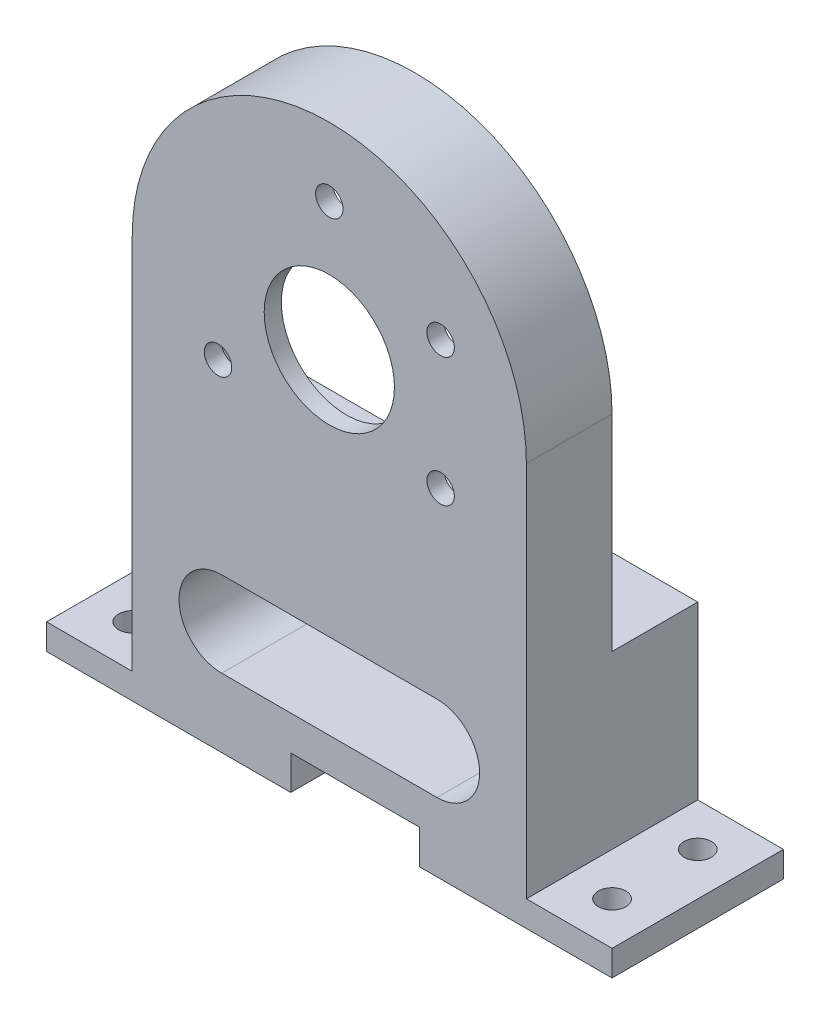
ISO-10303-21;
HEADER;
FILE_DESCRIPTION(('STEP AP214'),'2;1');
FILE_NAME('part.step','',(''),(''),'','','');
FILE_SCHEMA(('AUTOMOTIVE_DESIGN { 1 0 10303 214 1 1 1 1 }'));
ENDSEC;
DATA;
#1=APPLICATION_CONTEXT('core data for automotive mechanical design processes');
#2=APPLICATION_PROTOCOL_DEFINITION('international standard','automotive_design',2000,#1);
#3=PRODUCT_CONTEXT('',#1,'mechanical');
#4=PRODUCT('Part','Part','',(#3));
#5=PRODUCT_RELATED_PRODUCT_CATEGORY('part','',(#4));
#6=PRODUCT_DEFINITION_FORMATION('','',#4);
#7=PRODUCT_DEFINITION_CONTEXT('part definition',#1,'design');
#8=PRODUCT_DEFINITION('design','',#6,#7);
#9=PRODUCT_DEFINITION_SHAPE('','',#8);
#10=(LENGTH_UNIT() NAMED_UNIT(*) SI_UNIT(.MILLI.,.METRE.));
#11=(NAMED_UNIT(*) PLANE_ANGLE_UNIT() SI_UNIT($,.RADIAN.));
#12=(NAMED_UNIT(*) SI_UNIT($,.STERADIAN.) SOLID_ANGLE_UNIT());
#13=UNCERTAINTY_MEASURE_WITH_UNIT(LENGTH_MEASURE(1.E-05),#10,'distance_accuracy_value','');
#14=(GEOMETRIC_REPRESENTATION_CONTEXT(3) GLOBAL_UNCERTAINTY_ASSIGNED_CONTEXT((#13)) GLOBAL_UNIT_ASSIGNED_CONTEXT((#10,
#11,#12)) REPRESENTATION_CONTEXT('',''));
#15=CARTESIAN_POINT('',(0.,0.,0.));
#16=DIRECTION('',(0.,0.,1.));
#17=DIRECTION('',(1.,0.,0.));
#18=AXIS2_PLACEMENT_3D('',#15,#16,#17);
#19=CARTESIAN_POINT('',(0.,-47.,0.));
#20=DIRECTION('',(0.,-1.,0.));
#21=DIRECTION('',(0.,0.,-1.));
#22=AXIS2_PLACEMENT_3D('',#19,#20,#21);
#23=PLANE('',#22);
#24=DIRECTION('',(0.,0.,1.));
#25=VECTOR('',#24,1.);
#26=CARTESIAN_POINT('',(10.5,-47.,0.));
#27=LINE('',#26,#25);
#28=CARTESIAN_POINT('',(10.5,-47.,0.));
#29=VERTEX_POINT('',#28);
#30=CARTESIAN_POINT('',(10.5,-47.,20.));
#31=VERTEX_POINT('',#30);
#32=EDGE_CURVE('E197',#29,#31,#27,.T.);
#33=ORIENTED_EDGE('',*,*,#32,.F.);
#34=DIRECTION('',(1.,0.,0.));
#35=VECTOR('',#34,1.);
#36=CARTESIAN_POINT('',(-23.,-47.,0.));
#37=LINE('',#36,#35);
#38=CARTESIAN_POINT('',(33.,-47.,0.));
#39=VERTEX_POINT('',#38);
#40=EDGE_CURVE('E289',#29,#39,#37,.T.);
#41=ORIENTED_EDGE('',*,*,#40,.T.);
#42=DIRECTION('',(0.,0.,1.));
#43=VECTOR('',#42,1.);
#44=CARTESIAN_POINT('',(33.,-47.,20.));
#45=LINE('',#44,#43);
#46=CARTESIAN_POINT('',(33.,-47.,20.));
#47=VERTEX_POINT('',#46);
#48=EDGE_CURVE('E236',#39,#47,#45,.T.);
#49=ORIENTED_EDGE('',*,*,#48,.T.);
#50=DIRECTION('',(-1.,0.,0.));
#51=VECTOR('',#50,1.);
#52=CARTESIAN_POINT('',(23.,-47.,20.));
#53=LINE('',#52,#51);
#54=EDGE_CURVE('E296',#47,#31,#53,.T.);
#55=ORIENTED_EDGE('',*,*,#54,.T.);
#56=EDGE_LOOP('',(#33,#41,#49,#55));
#57=FACE_BOUND('',#56,.T.);
#58=CARTESIAN_POINT('',(28.,-47.,5.));
#59=DIRECTION('',(0.,-1.,0.));
#60=DIRECTION('',(0.,0.,-1.));
#61=AXIS2_PLACEMENT_3D('',#58,#59,#60);
#62=CIRCLE('',#61,1.6);
#63=CARTESIAN_POINT('',(28.,-47.,3.4));
#64=VERTEX_POINT('',#63);
#65=EDGE_CURVE('E230',#64,#64,#62,.T.);
#66=ORIENTED_EDGE('',*,*,#65,.F.);
#67=EDGE_LOOP('',(#66));
#68=FACE_BOUND('',#67,.T.);
#69=CARTESIAN_POINT('',(28.,-47.,15.));
#70=DIRECTION('',(0.,-1.,0.));
#71=DIRECTION('',(0.,0.,-1.));
#72=AXIS2_PLACEMENT_3D('',#69,#70,#71);
#73=CIRCLE('',#72,1.6);
#74=CARTESIAN_POINT('',(28.,-47.,13.4));
#75=VERTEX_POINT('',#74);
#76=EDGE_CURVE('E219',#75,#75,#73,.T.);
#77=ORIENTED_EDGE('',*,*,#76,.F.);
#78=EDGE_LOOP('',(#77));
#79=FACE_BOUND('',#78,.T.);
#80=ADVANCED_FACE('F37',(#57,#68,#79),#23,.T.);
#81=CARTESIAN_POINT('',(-23.,0.,20.));
#82=DIRECTION('',(1.,0.,0.));
#83=DIRECTION('',(0.,1.,0.));
#84=AXIS2_PLACEMENT_3D('',#81,#82,#83);
#85=PLANE('',#84);
#86=DIRECTION('',(0.,0.,1.));
#87=VECTOR('',#86,1.);
#88=CARTESIAN_POINT('',(-23.,-44.,20.));
#89=LINE('',#88,#87);
#90=CARTESIAN_POINT('',(-23.,-44.,0.));
#91=VERTEX_POINT('',#90);
#92=CARTESIAN_POINT('',(-23.,-44.,20.));
#93=VERTEX_POINT('',#92);
#94=EDGE_CURVE('E271',#91,#93,#89,.T.);
#95=ORIENTED_EDGE('',*,*,#94,.T.);
#96=DIRECTION('',(0.,-1.,0.));
#97=VECTOR('',#96,1.);
#98=CARTESIAN_POINT('',(-23.,0.,20.));
#99=LINE('',#98,#97);
#100=CARTESIAN_POINT('',(-23.,0.,20.));
#101=VERTEX_POINT('',#100);
#102=EDGE_CURVE('E346',#101,#93,#99,.T.);
#103=ORIENTED_EDGE('',*,*,#102,.F.);
#104=DIRECTION('',(0.,0.,-1.));
#105=VECTOR('',#104,1.);
#106=CARTESIAN_POINT('',(-23.,0.,20.));
#107=LINE('',#106,#105);
#108=CARTESIAN_POINT('',(-23.,0.,10.));
#109=VERTEX_POINT('',#108);
#110=EDGE_CURVE('E11',#101,#109,#107,.T.);
#111=ORIENTED_EDGE('',*,*,#110,.T.);
#112=DIRECTION('',(0.,1.,0.));
#113=VECTOR('',#112,1.);
#114=CARTESIAN_POINT('',(-23.,-24.,10.));
#115=LINE('',#114,#113);
#116=CARTESIAN_POINT('',(-23.,-24.,10.));
#117=VERTEX_POINT('',#116);
#118=EDGE_CURVE('E331',#117,#109,#115,.T.);
#119=ORIENTED_EDGE('',*,*,#118,.F.);
#120=DIRECTION('',(0.,0.,-1.));
#121=VECTOR('',#120,1.);
#122=CARTESIAN_POINT('',(-23.,-24.,10.));
#123=LINE('',#122,#121);
#124=CARTESIAN_POINT('',(-23.,-24.,0.));
#125=VERTEX_POINT('',#124);
#126=EDGE_CURVE('E337',#117,#125,#123,.T.);
#127=ORIENTED_EDGE('',*,*,#126,.T.);
#128=DIRECTION('',(0.,-1.,0.));
#129=VECTOR('',#128,1.);
#130=CARTESIAN_POINT('',(-23.,0.,0.));
#131=LINE('',#130,#129);
#132=EDGE_CURVE('E340',#125,#91,#131,.T.);
#133=ORIENTED_EDGE('',*,*,#132,.T.);
#134=EDGE_LOOP('',(#95,#103,#111,#119,#127,#133));
#135=FACE_BOUND('',#134,.T.);
#136=ADVANCED_FACE('F412',(#135),#85,.F.);
#137=CARTESIAN_POINT('',(0.,0.,20.));
#138=DIRECTION('',(0.,0.,-1.));
#139=DIRECTION('',(-1.,0.,0.));
#140=AXIS2_PLACEMENT_3D('',#137,#138,#139);
#141=CYLINDRICAL_SURFACE('',#140,23.);
#142=CARTESIAN_POINT('',(0.,0.,10.));
#143=DIRECTION('',(0.,0.,-1.));
#144=DIRECTION('',(-1.,0.,0.));
#145=AXIS2_PLACEMENT_3D('',#142,#143,#144);
#146=CIRCLE('',#145,23.);
#147=CARTESIAN_POINT('',(23.,0.,10.));
#148=VERTEX_POINT('',#147);
#149=EDGE_CURVE('E333',#109,#148,#146,.T.);
#150=ORIENTED_EDGE('',*,*,#149,.F.);
#151=ORIENTED_EDGE('',*,*,#110,.F.);
#152=CARTESIAN_POINT('',(0.,0.,20.));
#153=DIRECTION('',(0.,0.,1.));
#154=DIRECTION('',(1.,0.,0.));
#155=AXIS2_PLACEMENT_3D('',#152,#153,#154);
#156=CIRCLE('',#155,23.);
#157=CARTESIAN_POINT('',(23.,0.,20.));
#158=VERTEX_POINT('',#157);
#159=EDGE_CURVE('E343',#158,#101,#156,.T.);
#160=ORIENTED_EDGE('',*,*,#159,.F.);
#161=DIRECTION('',(0.,0.,-1.));
#162=VECTOR('',#161,1.);
#163=CARTESIAN_POINT('',(23.,0.,20.));
#164=LINE('',#163,#162);
#165=EDGE_CURVE('E46',#158,#148,#164,.T.);
#166=ORIENTED_EDGE('',*,*,#165,.T.);
#167=EDGE_LOOP('',(#150,#151,#160,#166));
#168=FACE_BOUND('',#167,.T.);
#169=ADVANCED_FACE('F39',(#168),#141,.T.);
#170=CARTESIAN_POINT('',(23.,-27.,20.));
#171=DIRECTION('',(-1.,0.,0.));
#172=DIRECTION('',(0.,-1.,0.));
#173=AXIS2_PLACEMENT_3D('',#170,#171,#172);
#174=PLANE('',#173);
#175=DIRECTION('',(0.,1.,0.));
#176=VECTOR('',#175,1.);
#177=CARTESIAN_POINT('',(23.,-27.,20.));
#178=LINE('',#177,#176);
#179=CARTESIAN_POINT('',(23.,-44.,20.));
#180=VERTEX_POINT('',#179);
#181=EDGE_CURVE('E350',#180,#158,#178,.T.);
#182=ORIENTED_EDGE('',*,*,#181,.F.);
#183=DIRECTION('',(0.,0.,-1.));
#184=VECTOR('',#183,1.);
#185=CARTESIAN_POINT('',(23.,-44.,20.));
#186=LINE('',#185,#184);
#187=CARTESIAN_POINT('',(23.,-44.,0.));
#188=VERTEX_POINT('',#187);
#189=EDGE_CURVE('E247',#180,#188,#186,.T.);
#190=ORIENTED_EDGE('',*,*,#189,.T.);
#191=DIRECTION('',(0.,1.,0.));
#192=VECTOR('',#191,1.);
#193=CARTESIAN_POINT('',(23.,-27.,0.));
#194=LINE('',#193,#192);
#195=CARTESIAN_POINT('',(23.,-24.,0.));
#196=VERTEX_POINT('',#195);
#197=EDGE_CURVE('E347',#188,#196,#194,.T.);
#198=ORIENTED_EDGE('',*,*,#197,.T.);
#199=DIRECTION('',(0.,0.,-1.));
#200=VECTOR('',#199,1.);
#201=CARTESIAN_POINT('',(23.,-24.,10.));
#202=LINE('',#201,#200);
#203=CARTESIAN_POINT('',(23.,-24.,10.));
#204=VERTEX_POINT('',#203);
#205=EDGE_CURVE('E335',#204,#196,#202,.T.);
#206=ORIENTED_EDGE('',*,*,#205,.F.);
#207=DIRECTION('',(0.,-1.,0.));
#208=VECTOR('',#207,1.);
#209=CARTESIAN_POINT('',(23.,0.,10.));
#210=LINE('',#209,#208);
#211=EDGE_CURVE('E325',#148,#204,#210,.T.);
#212=ORIENTED_EDGE('',*,*,#211,.F.);
#213=ORIENTED_EDGE('',*,*,#165,.F.);
#214=EDGE_LOOP('',(#182,#190,#198,#206,#212,#213));
#215=FACE_BOUND('',#214,.T.);
#216=ADVANCED_FACE('F402',(#215),#174,.F.);
#217=CARTESIAN_POINT('',(0.,0.,20.));
#218=DIRECTION('',(0.,0.,1.));
#219=DIRECTION('',(1.,0.,0.));
#220=AXIS2_PLACEMENT_3D('',#217,#218,#219);
#221=PLANE('',#220);
#222=CARTESIAN_POINT('',(12.5661510663552,-34.,20.));
#223=DIRECTION('',(0.,0.,-1.));
#224=DIRECTION('',(-1.,0.,0.));
#225=AXIS2_PLACEMENT_3D('',#222,#223,#224);
#226=CIRCLE('',#225,4.97169490372194);
#227=CARTESIAN_POINT('',(12.5661510663552,-29.0283050962781,20.));
#228=VERTEX_POINT('',#227);
#229=CARTESIAN_POINT('',(12.5661510663552,-38.9716949037219,20.));
#230=VERTEX_POINT('',#229);
#231=EDGE_CURVE('E166',#228,#230,#226,.T.);
#232=ORIENTED_EDGE('',*,*,#231,.T.);
#233=DIRECTION('',(-1.,0.,0.));
#234=VECTOR('',#233,1.);
#235=CARTESIAN_POINT('',(12.5661510663552,-38.9716949037219,20.));
#236=LINE('',#235,#234);
#237=CARTESIAN_POINT('',(-12.5661510663552,-38.9716949037219,20.));
#238=VERTEX_POINT('',#237);
#239=EDGE_CURVE('E175',#230,#238,#236,.T.);
#240=ORIENTED_EDGE('',*,*,#239,.T.);
#241=CARTESIAN_POINT('',(-12.5661510663552,-34.,20.));
#242=DIRECTION('',(0.,0.,-1.));
#243=DIRECTION('',(-1.,0.,0.));
#244=AXIS2_PLACEMENT_3D('',#241,#242,#243);
#245=CIRCLE('',#244,4.97169490372194);
#246=CARTESIAN_POINT('',(-12.5661510663552,-29.0283050962781,20.));
#247=VERTEX_POINT('',#246);
#248=EDGE_CURVE('E54',#238,#247,#245,.T.);
#249=ORIENTED_EDGE('',*,*,#248,.T.);
#250=DIRECTION('',(1.,0.,0.));
#251=VECTOR('',#250,1.);
#252=CARTESIAN_POINT('',(12.5661510663552,-29.0283050962781,20.));
#253=LINE('',#252,#251);
#254=EDGE_CURVE('E172',#247,#228,#253,.T.);
#255=ORIENTED_EDGE('',*,*,#254,.T.);
#256=EDGE_LOOP('',(#232,#240,#249,#255));
#257=FACE_BOUND('',#256,.T.);
#258=DIRECTION('',(0.,-1.,0.));
#259=VECTOR('',#258,1.);
#260=CARTESIAN_POINT('',(10.5,-43.,20.));
#261=LINE('',#260,#259);
#262=CARTESIAN_POINT('',(10.5,-43.,20.));
#263=VERTEX_POINT('',#262);
#264=EDGE_CURVE('E214',#263,#31,#261,.T.);
#265=ORIENTED_EDGE('',*,*,#264,.T.);
#266=ORIENTED_EDGE('',*,*,#54,.F.);
#267=DIRECTION('',(0.,-1.,0.));
#268=VECTOR('',#267,1.);
#269=CARTESIAN_POINT('',(33.,-44.,20.));
#270=LINE('',#269,#268);
#271=CARTESIAN_POINT('',(33.,-44.,20.));
#272=VERTEX_POINT('',#271);
#273=EDGE_CURVE('E253',#272,#47,#270,.T.);
#274=ORIENTED_EDGE('',*,*,#273,.F.);
#275=DIRECTION('',(-1.,0.,0.));
#276=VECTOR('',#275,1.);
#277=CARTESIAN_POINT('',(23.,-44.,20.));
#278=LINE('',#277,#276);
#279=EDGE_CURVE('E245',#272,#180,#278,.T.);
#280=ORIENTED_EDGE('',*,*,#279,.T.);
#281=ORIENTED_EDGE('',*,*,#181,.T.);
#282=ORIENTED_EDGE('',*,*,#159,.T.);
#283=ORIENTED_EDGE('',*,*,#102,.T.);
#284=DIRECTION('',(-1.,0.,0.));
#285=VECTOR('',#284,1.);
#286=CARTESIAN_POINT('',(-33.,-44.,20.));
#287=LINE('',#286,#285);
#288=CARTESIAN_POINT('',(-33.,-44.,20.));
#289=VERTEX_POINT('',#288);
#290=EDGE_CURVE('E274',#93,#289,#287,.T.);
#291=ORIENTED_EDGE('',*,*,#290,.T.);
#292=DIRECTION('',(0.,-1.,0.));
#293=VECTOR('',#292,1.);
#294=CARTESIAN_POINT('',(-33.,-44.,20.));
#295=LINE('',#294,#293);
#296=CARTESIAN_POINT('',(-33.,-47.,20.));
#297=VERTEX_POINT('',#296);
#298=EDGE_CURVE('E283',#289,#297,#295,.T.);
#299=ORIENTED_EDGE('',*,*,#298,.T.);
#300=CARTESIAN_POINT('',(-4.5,-47.,20.));
#301=VERTEX_POINT('',#300);
#302=EDGE_CURVE('E295',#301,#297,#53,.T.);
#303=ORIENTED_EDGE('',*,*,#302,.F.);
#304=DIRECTION('',(0.,-1.,0.));
#305=VECTOR('',#304,1.);
#306=CARTESIAN_POINT('',(-4.5,-43.,20.));
#307=LINE('',#306,#305);
#308=CARTESIAN_POINT('',(-4.5,-43.,20.));
#309=VERTEX_POINT('',#308);
#310=EDGE_CURVE('E223',#309,#301,#307,.T.);
#311=ORIENTED_EDGE('',*,*,#310,.F.);
#312=DIRECTION('',(-1.,0.,0.));
#313=VECTOR('',#312,1.);
#314=CARTESIAN_POINT('',(-4.5,-43.,20.));
#315=LINE('',#314,#313);
#316=EDGE_CURVE('E204',#263,#309,#315,.T.);
#317=ORIENTED_EDGE('',*,*,#316,.F.);
#318=EDGE_LOOP('',(#265,#266,#274,#280,#281,#282,#283,#291,#299,#303,#311,#317));
#319=FACE_BOUND('',#318,.T.);
#320=CARTESIAN_POINT('',(0.,0.,20.));
#321=DIRECTION('',(0.,0.,1.));
#322=DIRECTION('',(1.,0.,0.));
#323=AXIS2_PLACEMENT_3D('',#320,#321,#322);
#324=CIRCLE('',#323,7.6);
#325=CARTESIAN_POINT('',(7.6,0.,20.));
#326=VERTEX_POINT('',#325);
#327=EDGE_CURVE('E302',#326,#326,#324,.T.);
#328=ORIENTED_EDGE('',*,*,#327,.F.);
#329=EDGE_LOOP('',(#328));
#330=FACE_BOUND('',#329,.T.);
#331=CARTESIAN_POINT('',(0.,15.,20.));
#332=DIRECTION('',(0.,0.,1.));
#333=DIRECTION('',(1.,0.,0.));
#334=AXIS2_PLACEMENT_3D('',#331,#332,#333);
#335=CIRCLE('',#334,1.6);
#336=CARTESIAN_POINT('',(1.6,15.,20.));
#337=VERTEX_POINT('',#336);
#338=EDGE_CURVE('E306',#337,#337,#335,.T.);
#339=ORIENTED_EDGE('',*,*,#338,.F.);
#340=EDGE_LOOP('',(#339));
#341=FACE_BOUND('',#340,.T.);
#342=CARTESIAN_POINT('',(12.9903810567666,-7.5,20.));
#343=DIRECTION('',(0.,0.,1.));
#344=DIRECTION('',(1.,0.,0.));
#345=AXIS2_PLACEMENT_3D('',#342,#343,#344);
#346=CIRCLE('',#345,1.6);
#347=CARTESIAN_POINT('',(14.5903810567666,-7.5,20.));
#348=VERTEX_POINT('',#347);
#349=EDGE_CURVE('E305',#348,#348,#346,.T.);
#350=ORIENTED_EDGE('',*,*,#349,.F.);
#351=EDGE_LOOP('',(#350));
#352=FACE_BOUND('',#351,.T.);
#353=CARTESIAN_POINT('',(12.9903810567666,7.5,20.));
#354=DIRECTION('',(0.,0.,1.));
#355=DIRECTION('',(1.,0.,0.));
#356=AXIS2_PLACEMENT_3D('',#353,#354,#355);
#357=CIRCLE('',#356,1.6);
#358=CARTESIAN_POINT('',(14.5903810567666,7.5,20.));
#359=VERTEX_POINT('',#358);
#360=EDGE_CURVE('E313',#359,#359,#357,.T.);
#361=ORIENTED_EDGE('',*,*,#360,.F.);
#362=EDGE_LOOP('',(#361));
#363=FACE_BOUND('',#362,.T.);
#364=CARTESIAN_POINT('',(-12.9903810567666,-7.49999999999991,20.));
#365=DIRECTION('',(0.,0.,1.));
#366=DIRECTION('',(1.,0.,0.));
#367=AXIS2_PLACEMENT_3D('',#364,#365,#366);
#368=CIRCLE('',#367,1.6);
#369=CARTESIAN_POINT('',(-11.3903810567666,-7.49999999999991,20.));
#370=VERTEX_POINT('',#369);
#371=EDGE_CURVE('E310',#370,#370,#368,.T.);
#372=ORIENTED_EDGE('',*,*,#371,.F.);
#373=EDGE_LOOP('',(#372));
#374=FACE_BOUND('',#373,.T.);
#375=ADVANCED_FACE('F179',(#257,#319,#330,#341,#352,#363,#374),#221,.T.);
#376=CARTESIAN_POINT('',(0.,0.,0.));
#377=DIRECTION('',(0.,0.,1.));
#378=DIRECTION('',(1.,0.,0.));
#379=AXIS2_PLACEMENT_3D('',#376,#377,#378);
#380=PLANE('',#379);
#381=DIRECTION('',(-1.,0.,0.));
#382=VECTOR('',#381,1.);
#383=CARTESIAN_POINT('',(12.5661510663552,-38.9716949037219,0.));
#384=LINE('',#383,#382);
#385=CARTESIAN_POINT('',(12.5661510663552,-38.971694903722,0.));
#386=VERTEX_POINT('',#385);
#387=CARTESIAN_POINT('',(-12.5661510663552,-38.9716949037219,0.));
#388=VERTEX_POINT('',#387);
#389=EDGE_CURVE('E191',#386,#388,#384,.T.);
#390=ORIENTED_EDGE('',*,*,#389,.F.);
#391=CARTESIAN_POINT('',(12.5661510663552,-34.,0.));
#392=DIRECTION('',(0.,0.,-1.));
#393=DIRECTION('',(-1.,0.,0.));
#394=AXIS2_PLACEMENT_3D('',#391,#392,#393);
#395=CIRCLE('',#394,4.97169490372194);
#396=CARTESIAN_POINT('',(12.5661510663552,-29.0283050962781,0.));
#397=VERTEX_POINT('',#396);
#398=EDGE_CURVE('E62',#397,#386,#395,.T.);
#399=ORIENTED_EDGE('',*,*,#398,.F.);
#400=DIRECTION('',(1.,0.,0.));
#401=VECTOR('',#400,1.);
#402=CARTESIAN_POINT('',(12.5661510663552,-29.0283050962781,0.));
#403=LINE('',#402,#401);
#404=CARTESIAN_POINT('',(-12.5661510663552,-29.0283050962781,0.));
#405=VERTEX_POINT('',#404);
#406=EDGE_CURVE('E182',#405,#397,#403,.T.);
#407=ORIENTED_EDGE('',*,*,#406,.F.);
#408=CARTESIAN_POINT('',(-12.5661510663552,-34.,0.));
#409=DIRECTION('',(0.,0.,-1.));
#410=DIRECTION('',(-1.,0.,0.));
#411=AXIS2_PLACEMENT_3D('',#408,#409,#410);
#412=CIRCLE('',#411,4.97169490372194);
#413=EDGE_CURVE('E185',#388,#405,#412,.T.);
#414=ORIENTED_EDGE('',*,*,#413,.F.);
#415=EDGE_LOOP('',(#390,#399,#407,#414));
#416=FACE_BOUND('',#415,.T.);
#417=ORIENTED_EDGE('',*,*,#40,.F.);
#418=DIRECTION('',(0.,-1.,0.));
#419=VECTOR('',#418,1.);
#420=CARTESIAN_POINT('',(10.5,-43.,0.));
#421=LINE('',#420,#419);
#422=CARTESIAN_POINT('',(10.5,-43.,0.));
#423=VERTEX_POINT('',#422);
#424=EDGE_CURVE('E217',#423,#29,#421,.T.);
#425=ORIENTED_EDGE('',*,*,#424,.F.);
#426=DIRECTION('',(1.,0.,0.));
#427=VECTOR('',#426,1.);
#428=CARTESIAN_POINT('',(-4.5,-43.,0.));
#429=LINE('',#428,#427);
#430=CARTESIAN_POINT('',(-4.5,-43.,0.));
#431=VERTEX_POINT('',#430);
#432=EDGE_CURVE('E211',#431,#423,#429,.T.);
#433=ORIENTED_EDGE('',*,*,#432,.F.);
#434=DIRECTION('',(0.,-1.,0.));
#435=VECTOR('',#434,1.);
#436=CARTESIAN_POINT('',(-4.5,-43.,0.));
#437=LINE('',#436,#435);
#438=CARTESIAN_POINT('',(-4.5,-47.,0.));
#439=VERTEX_POINT('',#438);
#440=EDGE_CURVE('E220',#431,#439,#437,.T.);
#441=ORIENTED_EDGE('',*,*,#440,.T.);
#442=CARTESIAN_POINT('',(-33.,-47.,0.));
#443=VERTEX_POINT('',#442);
#444=EDGE_CURVE('E292',#443,#439,#37,.T.);
#445=ORIENTED_EDGE('',*,*,#444,.F.);
#446=DIRECTION('',(0.,-1.,0.));
#447=VECTOR('',#446,1.);
#448=CARTESIAN_POINT('',(-33.,-44.,0.));
#449=LINE('',#448,#447);
#450=CARTESIAN_POINT('',(-33.,-44.,0.));
#451=VERTEX_POINT('',#450);
#452=EDGE_CURVE('E286',#451,#443,#449,.T.);
#453=ORIENTED_EDGE('',*,*,#452,.F.);
#454=DIRECTION('',(1.,0.,0.));
#455=VECTOR('',#454,1.);
#456=CARTESIAN_POINT('',(-33.,-44.,0.));
#457=LINE('',#456,#455);
#458=EDGE_CURVE('E280',#451,#91,#457,.T.);
#459=ORIENTED_EDGE('',*,*,#458,.T.);
#460=ORIENTED_EDGE('',*,*,#132,.F.);
#461=DIRECTION('',(-1.,0.,0.));
#462=VECTOR('',#461,1.);
#463=CARTESIAN_POINT('',(23.,-24.,0.));
#464=LINE('',#463,#462);
#465=EDGE_CURVE('E321',#196,#125,#464,.T.);
#466=ORIENTED_EDGE('',*,*,#465,.F.);
#467=ORIENTED_EDGE('',*,*,#197,.F.);
#468=DIRECTION('',(1.,0.,0.));
#469=VECTOR('',#468,1.);
#470=CARTESIAN_POINT('',(23.,-44.,0.));
#471=LINE('',#470,#469);
#472=CARTESIAN_POINT('',(33.,-44.,0.));
#473=VERTEX_POINT('',#472);
#474=EDGE_CURVE('E239',#188,#473,#471,.T.);
#475=ORIENTED_EDGE('',*,*,#474,.T.);
#476=DIRECTION('',(0.,-1.,0.));
#477=VECTOR('',#476,1.);
#478=CARTESIAN_POINT('',(33.,-44.,0.));
#479=LINE('',#478,#477);
#480=EDGE_CURVE('E250',#473,#39,#479,.T.);
#481=ORIENTED_EDGE('',*,*,#480,.T.);
#482=EDGE_LOOP('',(#417,#425,#433,#441,#445,#453,#459,#460,#466,#467,#475,#481));
#483=FACE_BOUND('',#482,.T.);
#484=ADVANCED_FACE('F409',(#416,#483),#380,.F.);
#485=CARTESIAN_POINT('',(23.,-24.,10.));
#486=DIRECTION('',(0.,-1.,0.));
#487=DIRECTION('',(0.,0.,-1.));
#488=AXIS2_PLACEMENT_3D('',#485,#486,#487);
#489=PLANE('',#488);
#490=ORIENTED_EDGE('',*,*,#465,.T.);
#491=ORIENTED_EDGE('',*,*,#126,.F.);
#492=DIRECTION('',(-1.,0.,0.));
#493=VECTOR('',#492,1.);
#494=CARTESIAN_POINT('',(23.,-24.,10.));
#495=LINE('',#494,#493);
#496=EDGE_CURVE('E328',#204,#117,#495,.T.);
#497=ORIENTED_EDGE('',*,*,#496,.F.);
#498=ORIENTED_EDGE('',*,*,#205,.T.);
#499=EDGE_LOOP('',(#490,#491,#497,#498));
#500=FACE_BOUND('',#499,.T.);
#501=ADVANCED_FACE('F393',(#500),#489,.F.);
#502=CARTESIAN_POINT('',(0.,0.,10.));
#503=DIRECTION('',(0.,0.,-1.));
#504=DIRECTION('',(-1.,0.,0.));
#505=AXIS2_PLACEMENT_3D('',#502,#503,#504);
#506=PLANE('',#505);
#507=CARTESIAN_POINT('',(0.,0.,10.));
#508=DIRECTION('',(0.,0.,-1.));
#509=DIRECTION('',(-1.,0.,0.));
#510=AXIS2_PLACEMENT_3D('',#507,#508,#509);
#511=CIRCLE('',#510,21.1);
#512=CARTESIAN_POINT('',(-21.1,0.,10.));
#513=VERTEX_POINT('',#512);
#514=EDGE_CURVE('E322',#513,#513,#511,.T.);
#515=ORIENTED_EDGE('',*,*,#514,.F.);
#516=EDGE_LOOP('',(#515));
#517=FACE_BOUND('',#516,.T.);
#518=ORIENTED_EDGE('',*,*,#211,.T.);
#519=ORIENTED_EDGE('',*,*,#496,.T.);
#520=ORIENTED_EDGE('',*,*,#118,.T.);
#521=ORIENTED_EDGE('',*,*,#149,.T.);
#522=EDGE_LOOP('',(#518,#519,#520,#521));
#523=FACE_BOUND('',#522,.T.);
#524=ADVANCED_FACE('F387',(#517,#523),#506,.T.);
#525=CARTESIAN_POINT('',(0.,0.,18.));
#526=DIRECTION('',(0.,0.,-1.));
#527=DIRECTION('',(-1.,0.,0.));
#528=AXIS2_PLACEMENT_3D('',#525,#526,#527);
#529=CYLINDRICAL_SURFACE('',#528,21.1);
#530=CARTESIAN_POINT('',(0.,0.,18.));
#531=DIRECTION('',(0.,0.,-1.));
#532=DIRECTION('',(-1.,0.,0.));
#533=AXIS2_PLACEMENT_3D('',#530,#531,#532);
#534=CIRCLE('',#533,21.1);
#535=CARTESIAN_POINT('',(-21.1,0.,18.));
#536=VERTEX_POINT('',#535);
#537=EDGE_CURVE('E318',#536,#536,#534,.T.);
#538=ORIENTED_EDGE('',*,*,#537,.F.);
#539=EDGE_LOOP('',(#538));
#540=FACE_BOUND('',#539,.T.);
#541=ORIENTED_EDGE('',*,*,#514,.T.);
#542=EDGE_LOOP('',(#541));
#543=FACE_BOUND('',#542,.T.);
#544=ADVANCED_FACE('F375',(#540,#543),#529,.F.);
#545=CARTESIAN_POINT('',(0.,0.,18.));
#546=DIRECTION('',(0.,0.,-1.));
#547=DIRECTION('',(-1.,0.,0.));
#548=AXIS2_PLACEMENT_3D('',#545,#546,#547);
#549=PLANE('',#548);
#550=CARTESIAN_POINT('',(0.,0.,18.));
#551=DIRECTION('',(0.,0.,-1.));
#552=DIRECTION('',(-1.,0.,0.));
#553=AXIS2_PLACEMENT_3D('',#550,#551,#552);
#554=CIRCLE('',#553,7.6);
#555=CARTESIAN_POINT('',(-7.6,0.,18.));
#556=VERTEX_POINT('',#555);
#557=EDGE_CURVE('E299',#556,#556,#554,.T.);
#558=ORIENTED_EDGE('',*,*,#557,.F.);
#559=EDGE_LOOP('',(#558));
#560=FACE_BOUND('',#559,.T.);
#561=CARTESIAN_POINT('',(0.,15.,18.));
#562=DIRECTION('',(0.,0.,-1.));
#563=DIRECTION('',(-1.,0.,0.));
#564=AXIS2_PLACEMENT_3D('',#561,#562,#563);
#565=CIRCLE('',#564,1.6);
#566=CARTESIAN_POINT('',(-1.6,15.,18.));
#567=VERTEX_POINT('',#566);
#568=EDGE_CURVE('E41',#567,#567,#565,.T.);
#569=ORIENTED_EDGE('',*,*,#568,.F.);
#570=EDGE_LOOP('',(#569));
#571=FACE_BOUND('',#570,.T.);
#572=CARTESIAN_POINT('',(12.9903810567666,-7.5,18.));
#573=DIRECTION('',(0.,0.,-1.));
#574=DIRECTION('',(-1.,0.,0.));
#575=AXIS2_PLACEMENT_3D('',#572,#573,#574);
#576=CIRCLE('',#575,1.6);
#577=CARTESIAN_POINT('',(11.3903810567666,-7.5,18.));
#578=VERTEX_POINT('',#577);
#579=EDGE_CURVE('E361',#578,#578,#576,.T.);
#580=ORIENTED_EDGE('',*,*,#579,.F.);
#581=EDGE_LOOP('',(#580));
#582=FACE_BOUND('',#581,.T.);
#583=CARTESIAN_POINT('',(12.9903810567666,7.5,18.));
#584=DIRECTION('',(0.,0.,-1.));
#585=DIRECTION('',(-1.,0.,0.));
#586=AXIS2_PLACEMENT_3D('',#583,#584,#585);
#587=CIRCLE('',#586,1.6);
#588=CARTESIAN_POINT('',(11.3903810567666,7.5,18.));
#589=VERTEX_POINT('',#588);
#590=EDGE_CURVE('E359',#589,#589,#587,.T.);
#591=ORIENTED_EDGE('',*,*,#590,.F.);
#592=EDGE_LOOP('',(#591));
#593=FACE_BOUND('',#592,.T.);
#594=CARTESIAN_POINT('',(-12.9903810567666,-7.49999999999991,18.));
#595=DIRECTION('',(0.,0.,-1.));
#596=DIRECTION('',(-1.,0.,0.));
#597=AXIS2_PLACEMENT_3D('',#594,#595,#596);
#598=CIRCLE('',#597,1.6);
#599=CARTESIAN_POINT('',(-14.5903810567666,-7.49999999999991,18.));
#600=VERTEX_POINT('',#599);
#601=EDGE_CURVE('E309',#600,#600,#598,.T.);
#602=ORIENTED_EDGE('',*,*,#601,.F.);
#603=EDGE_LOOP('',(#602));
#604=FACE_BOUND('',#603,.T.);
#605=ORIENTED_EDGE('',*,*,#537,.T.);
#606=EDGE_LOOP('',(#605));
#607=FACE_BOUND('',#606,.T.);
#608=ADVANCED_FACE('F371',(#560,#571,#582,#593,#604,#607),#549,.T.);
#609=CARTESIAN_POINT('',(-12.9903810567666,-7.49999999999991,17.));
#610=DIRECTION('',(0.,0.,1.));
#611=DIRECTION('',(1.,0.,0.));
#612=AXIS2_PLACEMENT_3D('',#609,#610,#611);
#613=CYLINDRICAL_SURFACE('',#612,1.6);
#614=ORIENTED_EDGE('',*,*,#601,.T.);
#615=EDGE_LOOP('',(#614));
#616=FACE_BOUND('',#615,.T.);
#617=ORIENTED_EDGE('',*,*,#371,.T.);
#618=EDGE_LOOP('',(#617));
#619=FACE_BOUND('',#618,.T.);
#620=ADVANCED_FACE('F374',(#616,#619),#613,.F.);
#621=CARTESIAN_POINT('',(12.9903810567666,7.5,17.));
#622=DIRECTION('',(0.,0.,1.));
#623=DIRECTION('',(1.,0.,0.));
#624=AXIS2_PLACEMENT_3D('',#621,#622,#623);
#625=CYLINDRICAL_SURFACE('',#624,1.6);
#626=ORIENTED_EDGE('',*,*,#590,.T.);
#627=EDGE_LOOP('',(#626));
#628=FACE_BOUND('',#627,.T.);
#629=ORIENTED_EDGE('',*,*,#360,.T.);
#630=EDGE_LOOP('',(#629));
#631=FACE_BOUND('',#630,.T.);
#632=ADVANCED_FACE('F482',(#628,#631),#625,.F.);
#633=CARTESIAN_POINT('',(12.9903810567666,-7.5,17.));
#634=DIRECTION('',(0.,0.,1.));
#635=DIRECTION('',(1.,0.,0.));
#636=AXIS2_PLACEMENT_3D('',#633,#634,#635);
#637=CYLINDRICAL_SURFACE('',#636,1.6);
#638=ORIENTED_EDGE('',*,*,#579,.T.);
#639=EDGE_LOOP('',(#638));
#640=FACE_BOUND('',#639,.T.);
#641=ORIENTED_EDGE('',*,*,#349,.T.);
#642=EDGE_LOOP('',(#641));
#643=FACE_BOUND('',#642,.T.);
#644=ADVANCED_FACE('F476',(#640,#643),#637,.F.);
#645=CARTESIAN_POINT('',(0.,15.,17.));
#646=DIRECTION('',(0.,0.,1.));
#647=DIRECTION('',(1.,0.,0.));
#648=AXIS2_PLACEMENT_3D('',#645,#646,#647);
#649=CYLINDRICAL_SURFACE('',#648,1.6);
#650=ORIENTED_EDGE('',*,*,#568,.T.);
#651=EDGE_LOOP('',(#650));
#652=FACE_BOUND('',#651,.T.);
#653=ORIENTED_EDGE('',*,*,#338,.T.);
#654=EDGE_LOOP('',(#653));
#655=FACE_BOUND('',#654,.T.);
#656=ADVANCED_FACE('F368',(#652,#655),#649,.F.);
#657=CARTESIAN_POINT('',(0.,0.,21.));
#658=DIRECTION('',(0.,0.,-1.));
#659=DIRECTION('',(-1.,0.,0.));
#660=AXIS2_PLACEMENT_3D('',#657,#658,#659);
#661=CYLINDRICAL_SURFACE('',#660,7.6);
#662=ORIENTED_EDGE('',*,*,#327,.T.);
#663=EDGE_LOOP('',(#662));
#664=FACE_BOUND('',#663,.T.);
#665=ORIENTED_EDGE('',*,*,#557,.T.);
#666=EDGE_LOOP('',(#665));
#667=FACE_BOUND('',#666,.T.);
#668=ADVANCED_FACE('F468',(#664,#667),#661,.F.);
#669=DIRECTION('',(0.,0.,-1.));
#670=VECTOR('',#669,1.);
#671=CARTESIAN_POINT('',(-4.5,-47.,0.));
#672=LINE('',#671,#670);
#673=EDGE_CURVE('E205',#301,#439,#672,.T.);
#674=ORIENTED_EDGE('',*,*,#673,.F.);
#675=ORIENTED_EDGE('',*,*,#302,.T.);
#676=DIRECTION('',(0.,0.,-1.));
#677=VECTOR('',#676,1.);
#678=CARTESIAN_POINT('',(-33.,-47.,20.));
#679=LINE('',#678,#677);
#680=EDGE_CURVE('E268',#297,#443,#679,.T.);
#681=ORIENTED_EDGE('',*,*,#680,.T.);
#682=ORIENTED_EDGE('',*,*,#444,.T.);
#683=EDGE_LOOP('',(#674,#675,#681,#682));
#684=FACE_BOUND('',#683,.T.);
#685=CARTESIAN_POINT('',(-28.,-47.,15.));
#686=DIRECTION('',(0.,-1.,0.));
#687=DIRECTION('',(0.,0.,-1.));
#688=AXIS2_PLACEMENT_3D('',#685,#686,#687);
#689=CIRCLE('',#688,1.6);
#690=CARTESIAN_POINT('',(-28.,-47.,13.4));
#691=VERTEX_POINT('',#690);
#692=EDGE_CURVE('E256',#691,#691,#689,.T.);
#693=ORIENTED_EDGE('',*,*,#692,.F.);
#694=EDGE_LOOP('',(#693));
#695=FACE_BOUND('',#694,.T.);
#696=CARTESIAN_POINT('',(-28.,-47.,5.));
#697=DIRECTION('',(0.,-1.,0.));
#698=DIRECTION('',(0.,0.,-1.));
#699=AXIS2_PLACEMENT_3D('',#696,#697,#698);
#700=CIRCLE('',#699,1.6);
#701=CARTESIAN_POINT('',(-28.,-47.,3.4));
#702=VERTEX_POINT('',#701);
#703=EDGE_CURVE('E262',#702,#702,#700,.T.);
#704=ORIENTED_EDGE('',*,*,#703,.F.);
#705=EDGE_LOOP('',(#704));
#706=FACE_BOUND('',#705,.T.);
#707=ADVANCED_FACE('F440',(#684,#695,#706),#23,.T.);
#708=CARTESIAN_POINT('',(-33.,-44.,20.));
#709=DIRECTION('',(-1.,0.,0.));
#710=DIRECTION('',(0.,0.,1.));
#711=AXIS2_PLACEMENT_3D('',#708,#709,#710);
#712=PLANE('',#711);
#713=ORIENTED_EDGE('',*,*,#680,.F.);
#714=ORIENTED_EDGE('',*,*,#298,.F.);
#715=DIRECTION('',(0.,0.,-1.));
#716=VECTOR('',#715,1.);
#717=CARTESIAN_POINT('',(-33.,-44.,20.));
#718=LINE('',#717,#716);
#719=EDGE_CURVE('E277',#289,#451,#718,.T.);
#720=ORIENTED_EDGE('',*,*,#719,.T.);
#721=ORIENTED_EDGE('',*,*,#452,.T.);
#722=EDGE_LOOP('',(#713,#714,#720,#721));
#723=FACE_BOUND('',#722,.T.);
#724=ADVANCED_FACE('F444',(#723),#712,.T.);
#725=CARTESIAN_POINT('',(0.,-44.,0.));
#726=DIRECTION('',(0.,-1.,0.));
#727=DIRECTION('',(0.,0.,-1.));
#728=AXIS2_PLACEMENT_3D('',#725,#726,#727);
#729=PLANE('',#728);
#730=CARTESIAN_POINT('',(-28.,-44.,15.));
#731=DIRECTION('',(0.,-1.,0.));
#732=DIRECTION('',(0.,0.,-1.));
#733=AXIS2_PLACEMENT_3D('',#730,#731,#732);
#734=CIRCLE('',#733,1.6);
#735=CARTESIAN_POINT('',(-28.,-44.,13.4));
#736=VERTEX_POINT('',#735);
#737=EDGE_CURVE('E259',#736,#736,#734,.T.);
#738=ORIENTED_EDGE('',*,*,#737,.T.);
#739=EDGE_LOOP('',(#738));
#740=FACE_BOUND('',#739,.T.);
#741=CARTESIAN_POINT('',(-28.,-44.,5.));
#742=DIRECTION('',(0.,-1.,0.));
#743=DIRECTION('',(0.,0.,-1.));
#744=AXIS2_PLACEMENT_3D('',#741,#742,#743);
#745=CIRCLE('',#744,1.6);
#746=CARTESIAN_POINT('',(-28.,-44.,3.4));
#747=VERTEX_POINT('',#746);
#748=EDGE_CURVE('E265',#747,#747,#745,.T.);
#749=ORIENTED_EDGE('',*,*,#748,.T.);
#750=EDGE_LOOP('',(#749));
#751=FACE_BOUND('',#750,.T.);
#752=ORIENTED_EDGE('',*,*,#94,.F.);
#753=ORIENTED_EDGE('',*,*,#458,.F.);
#754=ORIENTED_EDGE('',*,*,#719,.F.);
#755=ORIENTED_EDGE('',*,*,#290,.F.);
#756=EDGE_LOOP('',(#752,#753,#754,#755));
#757=FACE_BOUND('',#756,.T.);
#758=ADVANCED_FACE('F447',(#740,#751,#757),#729,.F.);
#759=CARTESIAN_POINT('',(-28.,-44.,5.));
#760=DIRECTION('',(0.,-1.,0.));
#761=DIRECTION('',(0.,0.,-1.));
#762=AXIS2_PLACEMENT_3D('',#759,#760,#761);
#763=CYLINDRICAL_SURFACE('',#762,1.6);
#764=ORIENTED_EDGE('',*,*,#748,.F.);
#765=EDGE_LOOP('',(#764));
#766=FACE_BOUND('',#765,.T.);
#767=ORIENTED_EDGE('',*,*,#703,.T.);
#768=EDGE_LOOP('',(#767));
#769=FACE_BOUND('',#768,.T.);
#770=ADVANCED_FACE('F449',(#766,#769),#763,.F.);
#771=CARTESIAN_POINT('',(-28.,-44.,15.));
#772=DIRECTION('',(0.,-1.,0.));
#773=DIRECTION('',(0.,0.,-1.));
#774=AXIS2_PLACEMENT_3D('',#771,#772,#773);
#775=CYLINDRICAL_SURFACE('',#774,1.6);
#776=ORIENTED_EDGE('',*,*,#737,.F.);
#777=EDGE_LOOP('',(#776));
#778=FACE_BOUND('',#777,.T.);
#779=ORIENTED_EDGE('',*,*,#692,.T.);
#780=EDGE_LOOP('',(#779));
#781=FACE_BOUND('',#780,.T.);
#782=ADVANCED_FACE('F456',(#778,#781),#775,.F.);
#783=CARTESIAN_POINT('',(33.,-44.,20.));
#784=DIRECTION('',(1.,0.,0.));
#785=DIRECTION('',(0.,0.,-1.));
#786=AXIS2_PLACEMENT_3D('',#783,#784,#785);
#787=PLANE('',#786);
#788=ORIENTED_EDGE('',*,*,#48,.F.);
#789=ORIENTED_EDGE('',*,*,#480,.F.);
#790=DIRECTION('',(0.,0.,1.));
#791=VECTOR('',#790,1.);
#792=CARTESIAN_POINT('',(33.,-44.,20.));
#793=LINE('',#792,#791);
#794=EDGE_CURVE('E242',#473,#272,#793,.T.);
#795=ORIENTED_EDGE('',*,*,#794,.T.);
#796=ORIENTED_EDGE('',*,*,#273,.T.);
#797=EDGE_LOOP('',(#788,#789,#795,#796));
#798=FACE_BOUND('',#797,.T.);
#799=ADVANCED_FACE('F425',(#798),#787,.T.);
#800=CARTESIAN_POINT('',(0.,-44.,0.));
#801=DIRECTION('',(0.,1.,0.));
#802=DIRECTION('',(0.,0.,1.));
#803=AXIS2_PLACEMENT_3D('',#800,#801,#802);
#804=PLANE('',#803);
#805=CARTESIAN_POINT('',(28.,-44.,15.));
#806=DIRECTION('',(0.,-1.,0.));
#807=DIRECTION('',(0.,0.,-1.));
#808=AXIS2_PLACEMENT_3D('',#805,#806,#807);
#809=CIRCLE('',#808,1.6);
#810=CARTESIAN_POINT('',(28.,-44.,13.4));
#811=VERTEX_POINT('',#810);
#812=EDGE_CURVE('E227',#811,#811,#809,.T.);
#813=ORIENTED_EDGE('',*,*,#812,.T.);
#814=EDGE_LOOP('',(#813));
#815=FACE_BOUND('',#814,.T.);
#816=CARTESIAN_POINT('',(28.,-44.,5.));
#817=DIRECTION('',(0.,-1.,0.));
#818=DIRECTION('',(0.,0.,-1.));
#819=AXIS2_PLACEMENT_3D('',#816,#817,#818);
#820=CIRCLE('',#819,1.6);
#821=CARTESIAN_POINT('',(28.,-44.,3.4));
#822=VERTEX_POINT('',#821);
#823=EDGE_CURVE('E233',#822,#822,#820,.T.);
#824=ORIENTED_EDGE('',*,*,#823,.T.);
#825=EDGE_LOOP('',(#824));
#826=FACE_BOUND('',#825,.T.);
#827=ORIENTED_EDGE('',*,*,#474,.F.);
#828=ORIENTED_EDGE('',*,*,#189,.F.);
#829=ORIENTED_EDGE('',*,*,#279,.F.);
#830=ORIENTED_EDGE('',*,*,#794,.F.);
#831=EDGE_LOOP('',(#827,#828,#829,#830));
#832=FACE_BOUND('',#831,.T.);
#833=ADVANCED_FACE('F421',(#815,#826,#832),#804,.T.);
#834=CARTESIAN_POINT('',(28.,-44.,5.));
#835=DIRECTION('',(0.,-1.,0.));
#836=DIRECTION('',(0.,0.,-1.));
#837=AXIS2_PLACEMENT_3D('',#834,#835,#836);
#838=CYLINDRICAL_SURFACE('',#837,1.6);
#839=ORIENTED_EDGE('',*,*,#823,.F.);
#840=EDGE_LOOP('',(#839));
#841=FACE_BOUND('',#840,.T.);
#842=ORIENTED_EDGE('',*,*,#65,.T.);
#843=EDGE_LOOP('',(#842));
#844=FACE_BOUND('',#843,.T.);
#845=ADVANCED_FACE('F561',(#841,#844),#838,.F.);
#846=CARTESIAN_POINT('',(28.,-44.,15.));
#847=DIRECTION('',(0.,-1.,0.));
#848=DIRECTION('',(0.,0.,-1.));
#849=AXIS2_PLACEMENT_3D('',#846,#847,#848);
#850=CYLINDRICAL_SURFACE('',#849,1.6);
#851=ORIENTED_EDGE('',*,*,#812,.F.);
#852=EDGE_LOOP('',(#851));
#853=FACE_BOUND('',#852,.T.);
#854=ORIENTED_EDGE('',*,*,#76,.T.);
#855=EDGE_LOOP('',(#854));
#856=FACE_BOUND('',#855,.T.);
#857=ADVANCED_FACE('F571',(#853,#856),#850,.F.);
#858=CARTESIAN_POINT('',(10.5,-43.,0.));
#859=DIRECTION('',(1.,0.,0.));
#860=DIRECTION('',(0.,0.,-1.));
#861=AXIS2_PLACEMENT_3D('',#858,#859,#860);
#862=PLANE('',#861);
#863=ORIENTED_EDGE('',*,*,#32,.T.);
#864=ORIENTED_EDGE('',*,*,#264,.F.);
#865=DIRECTION('',(0.,0.,1.));
#866=VECTOR('',#865,1.);
#867=CARTESIAN_POINT('',(10.5,-43.,0.));
#868=LINE('',#867,#866);
#869=EDGE_CURVE('E201',#423,#263,#868,.T.);
#870=ORIENTED_EDGE('',*,*,#869,.F.);
#871=ORIENTED_EDGE('',*,*,#424,.T.);
#872=EDGE_LOOP('',(#863,#864,#870,#871));
#873=FACE_BOUND('',#872,.T.);
#874=ADVANCED_FACE('F430',(#873),#862,.F.);
#875=CARTESIAN_POINT('',(-4.5,-43.,0.));
#876=DIRECTION('',(-1.,0.,0.));
#877=DIRECTION('',(0.,0.,1.));
#878=AXIS2_PLACEMENT_3D('',#875,#876,#877);
#879=PLANE('',#878);
#880=ORIENTED_EDGE('',*,*,#673,.T.);
#881=ORIENTED_EDGE('',*,*,#440,.F.);
#882=DIRECTION('',(0.,0.,-1.));
#883=VECTOR('',#882,1.);
#884=CARTESIAN_POINT('',(-4.5,-43.,0.));
#885=LINE('',#884,#883);
#886=EDGE_CURVE('E208',#309,#431,#885,.T.);
#887=ORIENTED_EDGE('',*,*,#886,.F.);
#888=ORIENTED_EDGE('',*,*,#310,.T.);
#889=EDGE_LOOP('',(#880,#881,#887,#888));
#890=FACE_BOUND('',#889,.T.);
#891=ADVANCED_FACE('F600',(#890),#879,.F.);
#892=CARTESIAN_POINT('',(0.,-43.,0.));
#893=DIRECTION('',(0.,1.,0.));
#894=DIRECTION('',(0.,0.,1.));
#895=AXIS2_PLACEMENT_3D('',#892,#893,#894);
#896=PLANE('',#895);
#897=ORIENTED_EDGE('',*,*,#869,.T.);
#898=ORIENTED_EDGE('',*,*,#316,.T.);
#899=ORIENTED_EDGE('',*,*,#886,.T.);
#900=ORIENTED_EDGE('',*,*,#432,.T.);
#901=EDGE_LOOP('',(#897,#898,#899,#900));
#902=FACE_BOUND('',#901,.T.);
#903=ADVANCED_FACE('F435',(#902),#896,.F.);
#904=CARTESIAN_POINT('',(12.5661510663552,-34.,20.));
#905=DIRECTION('',(0.,0.,-1.));
#906=DIRECTION('',(-1.,0.,0.));
#907=AXIS2_PLACEMENT_3D('',#904,#905,#906);
#908=CYLINDRICAL_SURFACE('',#907,4.97169490372194);
#909=ORIENTED_EDGE('',*,*,#398,.T.);
#910=DIRECTION('',(0.,0.,-1.));
#911=VECTOR('',#910,1.);
#912=CARTESIAN_POINT('',(12.5661510663552,-38.9716949037219,20.));
#913=LINE('',#912,#911);
#914=EDGE_CURVE('E162',#230,#386,#913,.T.);
#915=ORIENTED_EDGE('',*,*,#914,.F.);
#916=ORIENTED_EDGE('',*,*,#231,.F.);
#917=DIRECTION('',(0.,0.,-1.));
#918=VECTOR('',#917,1.);
#919=CARTESIAN_POINT('',(12.5661510663552,-29.0283050962781,20.));
#920=LINE('',#919,#918);
#921=EDGE_CURVE('E195',#228,#397,#920,.T.);
#922=ORIENTED_EDGE('',*,*,#921,.T.);
#923=EDGE_LOOP('',(#909,#915,#916,#922));
#924=FACE_BOUND('',#923,.T.);
#925=ADVANCED_FACE('F164',(#924),#908,.F.);
#926=CARTESIAN_POINT('',(12.5661510663552,-29.0283050962781,20.));
#927=DIRECTION('',(0.,1.,0.));
#928=DIRECTION('',(-1.,0.,0.));
#929=AXIS2_PLACEMENT_3D('',#926,#927,#928);
#930=PLANE('',#929);
#931=ORIENTED_EDGE('',*,*,#406,.T.);
#932=ORIENTED_EDGE('',*,*,#921,.F.);
#933=ORIENTED_EDGE('',*,*,#254,.F.);
#934=DIRECTION('',(0.,0.,-1.));
#935=VECTOR('',#934,1.);
#936=CARTESIAN_POINT('',(-12.5661510663552,-29.0283050962781,20.));
#937=LINE('',#936,#935);
#938=EDGE_CURVE('E198',#247,#405,#937,.T.);
#939=ORIENTED_EDGE('',*,*,#938,.T.);
#940=EDGE_LOOP('',(#931,#932,#933,#939));
#941=FACE_BOUND('',#940,.T.);
#942=ADVANCED_FACE('F638',(#941),#930,.F.);
#943=CARTESIAN_POINT('',(-12.5661510663552,-34.,20.));
#944=DIRECTION('',(0.,0.,-1.));
#945=DIRECTION('',(-1.,0.,0.));
#946=AXIS2_PLACEMENT_3D('',#943,#944,#945);
#947=CYLINDRICAL_SURFACE('',#946,4.97169490372194);
#948=ORIENTED_EDGE('',*,*,#413,.T.);
#949=ORIENTED_EDGE('',*,*,#938,.F.);
#950=ORIENTED_EDGE('',*,*,#248,.F.);
#951=DIRECTION('',(0.,0.,-1.));
#952=VECTOR('',#951,1.);
#953=CARTESIAN_POINT('',(-12.5661510663552,-38.9716949037219,20.));
#954=LINE('',#953,#952);
#955=EDGE_CURVE('E171',#238,#388,#954,.T.);
#956=ORIENTED_EDGE('',*,*,#955,.T.);
#957=EDGE_LOOP('',(#948,#949,#950,#956));
#958=FACE_BOUND('',#957,.T.);
#959=ADVANCED_FACE('F647',(#958),#947,.F.);
#960=CARTESIAN_POINT('',(12.5661510663552,-38.9716949037219,20.));
#961=DIRECTION('',(0.,-1.,0.));
#962=DIRECTION('',(1.,0.,0.));
#963=AXIS2_PLACEMENT_3D('',#960,#961,#962);
#964=PLANE('',#963);
#965=ORIENTED_EDGE('',*,*,#389,.T.);
#966=ORIENTED_EDGE('',*,*,#955,.F.);
#967=ORIENTED_EDGE('',*,*,#239,.F.);
#968=ORIENTED_EDGE('',*,*,#914,.T.);
#969=EDGE_LOOP('',(#965,#966,#967,#968));
#970=FACE_BOUND('',#969,.T.);
#971=ADVANCED_FACE('F176',(#970),#964,.F.);
#972=CLOSED_SHELL('',(#80,#136,#169,#216,#375,#484,#501,#524,#544,#608,#620,#632,#644,#656,#668,
#707,#724,#758,#770,#782,#799,#833,#845,#857,#874,#891,#903,#925,#942,#959,#971));
#973=MANIFOLD_SOLID_BREP('B2',#972);
#974=ADVANCED_BREP_SHAPE_REPRESENTATION('',(#18,#973),#14);
#975=SHAPE_DEFINITION_REPRESENTATION(#9,#974);
ENDSEC;
END-ISO-10303-21;
